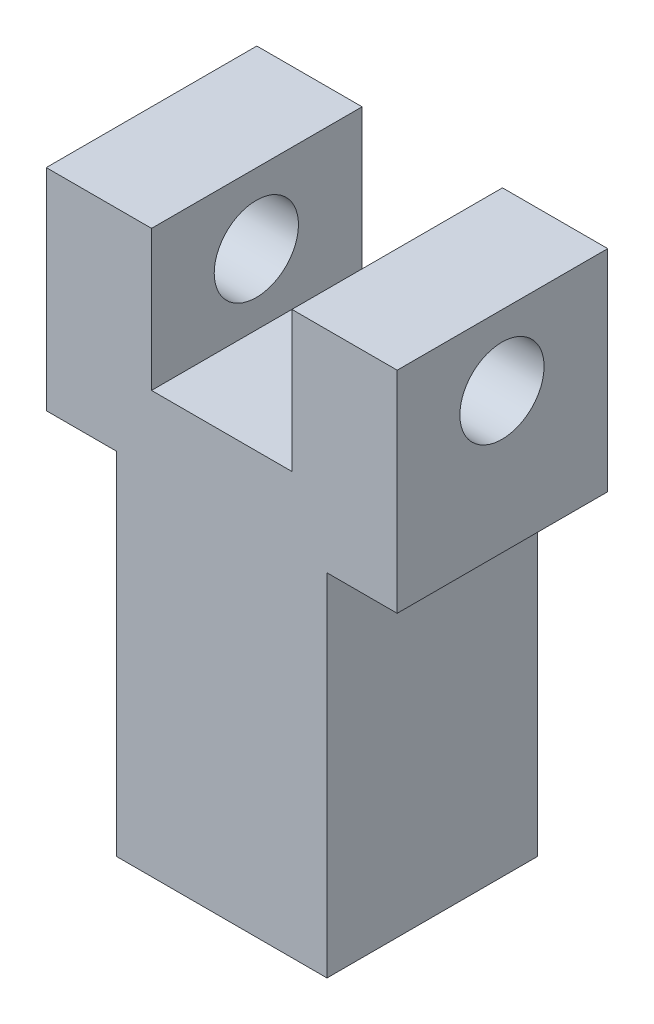
ISO-10303-21;
HEADER;
FILE_DESCRIPTION(('STEP AP214'),'2;1');
FILE_NAME('part.step','',(''),(''),'','','');
FILE_SCHEMA(('AUTOMOTIVE_DESIGN { 1 0 10303 214 1 1 1 1 }'));
ENDSEC;
DATA;
#1=APPLICATION_CONTEXT('core data for automotive mechanical design processes');
#2=APPLICATION_PROTOCOL_DEFINITION('international standard','automotive_design',2000,#1);
#3=PRODUCT_CONTEXT('',#1,'mechanical');
#4=PRODUCT('Part','Part','',(#3));
#5=PRODUCT_RELATED_PRODUCT_CATEGORY('part','',(#4));
#6=PRODUCT_DEFINITION_FORMATION('','',#4);
#7=PRODUCT_DEFINITION_CONTEXT('part definition',#1,'design');
#8=PRODUCT_DEFINITION('design','',#6,#7);
#9=PRODUCT_DEFINITION_SHAPE('','',#8);
#10=(LENGTH_UNIT() NAMED_UNIT(*) SI_UNIT(.MILLI.,.METRE.));
#11=(NAMED_UNIT(*) PLANE_ANGLE_UNIT() SI_UNIT($,.RADIAN.));
#12=(NAMED_UNIT(*) SI_UNIT($,.STERADIAN.) SOLID_ANGLE_UNIT());
#13=UNCERTAINTY_MEASURE_WITH_UNIT(LENGTH_MEASURE(1.E-05),#10,'distance_accuracy_value','');
#14=(GEOMETRIC_REPRESENTATION_CONTEXT(3) GLOBAL_UNCERTAINTY_ASSIGNED_CONTEXT((#13)) GLOBAL_UNIT_ASSIGNED_CONTEXT((#10,
#11,#12)) REPRESENTATION_CONTEXT('',''));
#15=CARTESIAN_POINT('',(0.,0.,0.));
#16=DIRECTION('',(0.,0.,1.));
#17=DIRECTION('',(1.,0.,0.));
#18=AXIS2_PLACEMENT_3D('',#15,#16,#17);
#19=CARTESIAN_POINT('',(-6.31241870357921,-36.0651970931253,9.91556758087119));
#20=DIRECTION('',(1.,0.,0.));
#21=DIRECTION('',(0.,0.,-1.));
#22=AXIS2_PLACEMENT_3D('',#19,#20,#21);
#23=PLANE('',#22);
#24=CARTESIAN_POINT('',(-6.31241870357921,-23.5651970931253,7.5));
#25=DIRECTION('',(1.,0.,0.));
#26=DIRECTION('',(0.,0.,-1.));
#27=AXIS2_PLACEMENT_3D('',#24,#25,#26);
#28=CIRCLE('',#27,3.);
#29=CARTESIAN_POINT('',(-6.31241870357921,-22.0418097257903,4.91556758087119));
#30=VERTEX_POINT('',#29);
#31=CARTESIAN_POINT('',(-6.31241870357921,-21.78614305734,9.91556758087119));
#32=VERTEX_POINT('',#31);
#33=EDGE_CURVE('E184',#30,#32,#28,.T.);
#34=ORIENTED_EDGE('',*,*,#33,.F.);
#35=DIRECTION('',(0.,1.,0.));
#36=VECTOR('',#35,1.);
#37=CARTESIAN_POINT('',(-6.31241870357921,-36.0651970931253,4.91556758087119));
#38=LINE('',#37,#36);
#39=CARTESIAN_POINT('',(-6.31241870357921,-11.0651970931253,4.91556758087119));
#40=VERTEX_POINT('',#39);
#41=EDGE_CURVE('E240',#30,#40,#38,.T.);
#42=ORIENTED_EDGE('',*,*,#41,.T.);
#43=DIRECTION('',(0.,0.,-1.));
#44=VECTOR('',#43,1.);
#45=CARTESIAN_POINT('',(-6.31241870357921,-11.0651970931253,9.91556758087119));
#46=LINE('',#45,#44);
#47=CARTESIAN_POINT('',(-6.31241870357921,-11.0651970931253,9.91556758087119));
#48=VERTEX_POINT('',#47);
#49=EDGE_CURVE('E231',#48,#40,#46,.T.);
#50=ORIENTED_EDGE('',*,*,#49,.F.);
#51=DIRECTION('',(0.,1.,0.));
#52=VECTOR('',#51,1.);
#53=CARTESIAN_POINT('',(-6.31241870357921,-36.0651970931253,9.91556758087119));
#54=LINE('',#53,#52);
#55=EDGE_CURVE('E245',#32,#48,#54,.T.);
#56=ORIENTED_EDGE('',*,*,#55,.F.);
#57=EDGE_LOOP('',(#34,#42,#50,#56));
#58=FACE_BOUND('',#57,.T.);
#59=ADVANCED_FACE('F39',(#58),#23,.T.);
#60=CARTESIAN_POINT('',(-13.8124187035792,-11.0651970931253,15.));
#61=DIRECTION('',(0.,1.,0.));
#62=DIRECTION('',(0.,0.,1.));
#63=AXIS2_PLACEMENT_3D('',#60,#61,#62);
#64=PLANE('',#63);
#65=DIRECTION('',(0.,0.,-1.));
#66=VECTOR('',#65,1.);
#67=CARTESIAN_POINT('',(-8.81241870357921,-11.0651970931253,15.));
#68=LINE('',#67,#66);
#69=CARTESIAN_POINT('',(-8.81241870357921,-11.0651970931253,15.));
#70=VERTEX_POINT('',#69);
#71=CARTESIAN_POINT('',(-8.81241870357921,-11.0651970931253,0.));
#72=VERTEX_POINT('',#71);
#73=EDGE_CURVE('E253',#70,#72,#68,.T.);
#74=ORIENTED_EDGE('',*,*,#73,.F.);
#75=DIRECTION('',(1.,0.,0.));
#76=VECTOR('',#75,1.);
#77=CARTESIAN_POINT('',(-13.8124187035792,-11.0651970931253,15.));
#78=LINE('',#77,#76);
#79=CARTESIAN_POINT('',(-13.8124187035792,-11.0651970931253,15.));
#80=VERTEX_POINT('',#79);
#81=EDGE_CURVE('E310',#80,#70,#78,.T.);
#82=ORIENTED_EDGE('',*,*,#81,.F.);
#83=DIRECTION('',(0.,0.,-1.));
#84=VECTOR('',#83,1.);
#85=CARTESIAN_POINT('',(-13.8124187035792,-11.0651970931253,15.));
#86=LINE('',#85,#84);
#87=CARTESIAN_POINT('',(-13.8124187035792,-11.0651970931253,0.));
#88=VERTEX_POINT('',#87);
#89=EDGE_CURVE('E384',#80,#88,#86,.T.);
#90=ORIENTED_EDGE('',*,*,#89,.T.);
#91=DIRECTION('',(1.,0.,0.));
#92=VECTOR('',#91,1.);
#93=CARTESIAN_POINT('',(-13.8124187035792,-11.0651970931253,0.));
#94=LINE('',#93,#92);
#95=EDGE_CURVE('E337',#88,#72,#94,.T.);
#96=ORIENTED_EDGE('',*,*,#95,.T.);
#97=EDGE_LOOP('',(#74,#82,#90,#96));
#98=FACE_BOUND('',#97,.T.);
#99=ADVANCED_FACE('F410',(#98),#64,.F.);
#100=DIRECTION('',(0.,0.,1.));
#101=VECTOR('',#100,1.);
#102=CARTESIAN_POINT('',(6.18758129642079,-11.0651970931253,15.));
#103=LINE('',#102,#101);
#104=CARTESIAN_POINT('',(6.18758129642079,-11.0651970931253,0.));
#105=VERTEX_POINT('',#104);
#106=CARTESIAN_POINT('',(6.18758129642079,-11.0651970931253,15.));
#107=VERTEX_POINT('',#106);
#108=EDGE_CURVE('E259',#105,#107,#103,.T.);
#109=ORIENTED_EDGE('',*,*,#108,.F.);
#110=CARTESIAN_POINT('',(11.1875812964208,-11.0651970931253,0.));
#111=VERTEX_POINT('',#110);
#112=EDGE_CURVE('E336',#105,#111,#94,.T.);
#113=ORIENTED_EDGE('',*,*,#112,.T.);
#114=DIRECTION('',(0.,0.,-1.));
#115=VECTOR('',#114,1.);
#116=CARTESIAN_POINT('',(11.1875812964208,-11.0651970931253,15.));
#117=LINE('',#116,#115);
#118=CARTESIAN_POINT('',(11.1875812964208,-11.0651970931253,15.));
#119=VERTEX_POINT('',#118);
#120=EDGE_CURVE('E380',#119,#111,#117,.T.);
#121=ORIENTED_EDGE('',*,*,#120,.F.);
#122=EDGE_CURVE('E308',#107,#119,#78,.T.);
#123=ORIENTED_EDGE('',*,*,#122,.F.);
#124=EDGE_LOOP('',(#109,#113,#121,#123));
#125=FACE_BOUND('',#124,.T.);
#126=ADVANCED_FACE('F419',(#125),#64,.F.);
#127=CARTESIAN_POINT('',(-13.8124187035792,3.93480290687469,15.));
#128=DIRECTION('',(1.,0.,0.));
#129=DIRECTION('',(0.,1.,0.));
#130=AXIS2_PLACEMENT_3D('',#127,#128,#129);
#131=PLANE('',#130);
#132=CARTESIAN_POINT('',(-13.8124187035792,-1.06519709312532,7.53488430776738));
#133=DIRECTION('',(1.,0.,0.));
#134=DIRECTION('',(0.,1.,0.));
#135=AXIS2_PLACEMENT_3D('',#132,#133,#134);
#136=CIRCLE('',#135,3.);
#137=CARTESIAN_POINT('',(-13.8124187035792,1.93480290687469,7.53488430776738));
#138=VERTEX_POINT('',#137);
#139=EDGE_CURVE('E299',#138,#138,#136,.T.);
#140=ORIENTED_EDGE('',*,*,#139,.T.);
#141=EDGE_LOOP('',(#140));
#142=FACE_BOUND('',#141,.T.);
#143=DIRECTION('',(0.,-1.,0.));
#144=VECTOR('',#143,1.);
#145=CARTESIAN_POINT('',(-13.8124187035792,3.93480290687469,0.));
#146=LINE('',#145,#144);
#147=CARTESIAN_POINT('',(-13.8124187035792,3.93480290687469,0.));
#148=VERTEX_POINT('',#147);
#149=EDGE_CURVE('E303',#148,#88,#146,.T.);
#150=ORIENTED_EDGE('',*,*,#149,.T.);
#151=ORIENTED_EDGE('',*,*,#89,.F.);
#152=DIRECTION('',(0.,-1.,0.));
#153=VECTOR('',#152,1.);
#154=CARTESIAN_POINT('',(-13.8124187035792,3.93480290687469,15.));
#155=LINE('',#154,#153);
#156=CARTESIAN_POINT('',(-13.8124187035792,3.93480290687469,15.));
#157=VERTEX_POINT('',#156);
#158=EDGE_CURVE('E304',#157,#80,#155,.T.);
#159=ORIENTED_EDGE('',*,*,#158,.F.);
#160=DIRECTION('',(0.,0.,-1.));
#161=VECTOR('',#160,1.);
#162=CARTESIAN_POINT('',(-13.8124187035792,3.93480290687469,15.));
#163=LINE('',#162,#161);
#164=EDGE_CURVE('E332',#157,#148,#163,.T.);
#165=ORIENTED_EDGE('',*,*,#164,.T.);
#166=EDGE_LOOP('',(#150,#151,#159,#165));
#167=FACE_BOUND('',#166,.T.);
#168=ADVANCED_FACE('F41',(#142,#167),#131,.F.);
#169=CARTESIAN_POINT('',(11.1875812964208,3.93480290687469,15.));
#170=DIRECTION('',(-1.,0.,0.));
#171=DIRECTION('',(0.,-1.,0.));
#172=AXIS2_PLACEMENT_3D('',#169,#170,#171);
#173=PLANE('',#172);
#174=CARTESIAN_POINT('',(11.1875812964208,-1.06519709312531,7.53488430776738));
#175=DIRECTION('',(1.,0.,0.));
#176=DIRECTION('',(0.,1.,0.));
#177=AXIS2_PLACEMENT_3D('',#174,#175,#176);
#178=CIRCLE('',#177,3.);
#179=CARTESIAN_POINT('',(11.1875812964208,1.93480290687469,7.53488430776738));
#180=VERTEX_POINT('',#179);
#181=EDGE_CURVE('E290',#180,#180,#178,.T.);
#182=ORIENTED_EDGE('',*,*,#181,.F.);
#183=EDGE_LOOP('',(#182));
#184=FACE_BOUND('',#183,.T.);
#185=DIRECTION('',(0.,1.,0.));
#186=VECTOR('',#185,1.);
#187=CARTESIAN_POINT('',(11.1875812964208,3.93480290687469,0.));
#188=LINE('',#187,#186);
#189=CARTESIAN_POINT('',(11.1875812964208,3.93480290687469,0.));
#190=VERTEX_POINT('',#189);
#191=EDGE_CURVE('E340',#111,#190,#188,.T.);
#192=ORIENTED_EDGE('',*,*,#191,.T.);
#193=DIRECTION('',(0.,0.,-1.));
#194=VECTOR('',#193,1.);
#195=CARTESIAN_POINT('',(11.1875812964208,3.93480290687469,15.));
#196=LINE('',#195,#194);
#197=CARTESIAN_POINT('',(11.1875812964208,3.93480290687469,15.));
#198=VERTEX_POINT('',#197);
#199=EDGE_CURVE('E376',#198,#190,#196,.T.);
#200=ORIENTED_EDGE('',*,*,#199,.F.);
#201=DIRECTION('',(0.,1.,0.));
#202=VECTOR('',#201,1.);
#203=CARTESIAN_POINT('',(11.1875812964208,3.93480290687469,15.));
#204=LINE('',#203,#202);
#205=EDGE_CURVE('E314',#119,#198,#204,.T.);
#206=ORIENTED_EDGE('',*,*,#205,.F.);
#207=ORIENTED_EDGE('',*,*,#120,.T.);
#208=EDGE_LOOP('',(#192,#200,#206,#207));
#209=FACE_BOUND('',#208,.T.);
#210=ADVANCED_FACE('F457',(#184,#209),#173,.F.);
#211=CARTESIAN_POINT('',(3.68758129642079,3.93480290687469,15.));
#212=DIRECTION('',(0.,-1.,0.));
#213=DIRECTION('',(0.,0.,-1.));
#214=AXIS2_PLACEMENT_3D('',#211,#212,#213);
#215=PLANE('',#214);
#216=DIRECTION('',(-1.,0.,0.));
#217=VECTOR('',#216,1.);
#218=CARTESIAN_POINT('',(3.68758129642079,3.93480290687469,0.));
#219=LINE('',#218,#217);
#220=CARTESIAN_POINT('',(3.68758129642079,3.93480290687469,0.));
#221=VERTEX_POINT('',#220);
#222=EDGE_CURVE('E343',#190,#221,#219,.T.);
#223=ORIENTED_EDGE('',*,*,#222,.T.);
#224=DIRECTION('',(0.,0.,-1.));
#225=VECTOR('',#224,1.);
#226=CARTESIAN_POINT('',(3.68758129642079,3.93480290687469,15.));
#227=LINE('',#226,#225);
#228=CARTESIAN_POINT('',(3.68758129642079,3.93480290687469,15.));
#229=VERTEX_POINT('',#228);
#230=EDGE_CURVE('E372',#229,#221,#227,.T.);
#231=ORIENTED_EDGE('',*,*,#230,.F.);
#232=DIRECTION('',(-1.,0.,0.));
#233=VECTOR('',#232,1.);
#234=CARTESIAN_POINT('',(3.68758129642079,3.93480290687469,15.));
#235=LINE('',#234,#233);
#236=EDGE_CURVE('E317',#198,#229,#235,.T.);
#237=ORIENTED_EDGE('',*,*,#236,.F.);
#238=ORIENTED_EDGE('',*,*,#199,.T.);
#239=EDGE_LOOP('',(#223,#231,#237,#238));
#240=FACE_BOUND('',#239,.T.);
#241=ADVANCED_FACE('F462',(#240),#215,.F.);
#242=CARTESIAN_POINT('',(3.68758129642079,3.93480290687469,15.));
#243=DIRECTION('',(1.,0.,0.));
#244=DIRECTION('',(0.,1.,0.));
#245=AXIS2_PLACEMENT_3D('',#242,#243,#244);
#246=PLANE('',#245);
#247=CARTESIAN_POINT('',(3.68758129642079,-1.06519709312531,7.53488430776738));
#248=DIRECTION('',(1.,0.,0.));
#249=DIRECTION('',(0.,1.,0.));
#250=AXIS2_PLACEMENT_3D('',#247,#248,#249);
#251=CIRCLE('',#250,3.);
#252=CARTESIAN_POINT('',(3.68758129642079,1.93480290687469,7.53488430776738));
#253=VERTEX_POINT('',#252);
#254=EDGE_CURVE('E295',#253,#253,#251,.T.);
#255=ORIENTED_EDGE('',*,*,#254,.T.);
#256=EDGE_LOOP('',(#255));
#257=FACE_BOUND('',#256,.T.);
#258=DIRECTION('',(0.,-1.,0.));
#259=VECTOR('',#258,1.);
#260=CARTESIAN_POINT('',(3.68758129642079,3.93480290687469,0.));
#261=LINE('',#260,#259);
#262=CARTESIAN_POINT('',(3.68758129642079,-6.06519709312531,0.));
#263=VERTEX_POINT('',#262);
#264=EDGE_CURVE('E346',#221,#263,#261,.T.);
#265=ORIENTED_EDGE('',*,*,#264,.T.);
#266=DIRECTION('',(0.,0.,-1.));
#267=VECTOR('',#266,1.);
#268=CARTESIAN_POINT('',(3.68758129642079,-6.06519709312531,15.));
#269=LINE('',#268,#267);
#270=CARTESIAN_POINT('',(3.68758129642079,-6.06519709312531,15.));
#271=VERTEX_POINT('',#270);
#272=EDGE_CURVE('E368',#271,#263,#269,.T.);
#273=ORIENTED_EDGE('',*,*,#272,.F.);
#274=DIRECTION('',(0.,-1.,0.));
#275=VECTOR('',#274,1.);
#276=CARTESIAN_POINT('',(3.68758129642079,3.93480290687469,15.));
#277=LINE('',#276,#275);
#278=EDGE_CURVE('E320',#229,#271,#277,.T.);
#279=ORIENTED_EDGE('',*,*,#278,.F.);
#280=ORIENTED_EDGE('',*,*,#230,.T.);
#281=EDGE_LOOP('',(#265,#273,#279,#280));
#282=FACE_BOUND('',#281,.T.);
#283=ADVANCED_FACE('F468',(#257,#282),#246,.F.);
#284=CARTESIAN_POINT('',(3.68758129642079,-6.06519709312531,15.));
#285=DIRECTION('',(0.,-1.,0.));
#286=DIRECTION('',(0.,0.,-1.));
#287=AXIS2_PLACEMENT_3D('',#284,#285,#286);
#288=PLANE('',#287);
#289=DIRECTION('',(-1.,0.,0.));
#290=VECTOR('',#289,1.);
#291=CARTESIAN_POINT('',(3.68758129642079,-6.06519709312531,0.));
#292=LINE('',#291,#290);
#293=CARTESIAN_POINT('',(-6.31241870357921,-6.06519709312531,0.));
#294=VERTEX_POINT('',#293);
#295=EDGE_CURVE('E349',#263,#294,#292,.T.);
#296=ORIENTED_EDGE('',*,*,#295,.T.);
#297=DIRECTION('',(0.,0.,-1.));
#298=VECTOR('',#297,1.);
#299=CARTESIAN_POINT('',(-6.31241870357921,-6.06519709312531,15.));
#300=LINE('',#299,#298);
#301=CARTESIAN_POINT('',(-6.31241870357921,-6.06519709312531,15.));
#302=VERTEX_POINT('',#301);
#303=EDGE_CURVE('E364',#302,#294,#300,.T.);
#304=ORIENTED_EDGE('',*,*,#303,.F.);
#305=DIRECTION('',(-1.,0.,0.));
#306=VECTOR('',#305,1.);
#307=CARTESIAN_POINT('',(3.68758129642079,-6.06519709312531,15.));
#308=LINE('',#307,#306);
#309=EDGE_CURVE('E323',#271,#302,#308,.T.);
#310=ORIENTED_EDGE('',*,*,#309,.F.);
#311=ORIENTED_EDGE('',*,*,#272,.T.);
#312=EDGE_LOOP('',(#296,#304,#310,#311));
#313=FACE_BOUND('',#312,.T.);
#314=ADVANCED_FACE('F472',(#313),#288,.F.);
#315=CARTESIAN_POINT('',(-6.31241870357921,-6.06519709312531,15.));
#316=DIRECTION('',(-1.,0.,0.));
#317=DIRECTION('',(0.,0.,1.));
#318=AXIS2_PLACEMENT_3D('',#315,#316,#317);
#319=PLANE('',#318);
#320=CARTESIAN_POINT('',(-6.31241870357921,-1.06519709312531,7.53488430776738));
#321=DIRECTION('',(-1.,0.,0.));
#322=DIRECTION('',(0.,0.,1.));
#323=AXIS2_PLACEMENT_3D('',#320,#321,#322);
#324=CIRCLE('',#323,3.);
#325=CARTESIAN_POINT('',(-6.31241870357921,-1.06519709312531,10.5348843077674));
#326=VERTEX_POINT('',#325);
#327=EDGE_CURVE('E294',#326,#326,#324,.T.);
#328=ORIENTED_EDGE('',*,*,#327,.T.);
#329=EDGE_LOOP('',(#328));
#330=FACE_BOUND('',#329,.T.);
#331=DIRECTION('',(0.,1.,0.));
#332=VECTOR('',#331,1.);
#333=CARTESIAN_POINT('',(-6.31241870357921,-6.06519709312531,0.));
#334=LINE('',#333,#332);
#335=CARTESIAN_POINT('',(-6.31241870357921,3.93480290687469,0.));
#336=VERTEX_POINT('',#335);
#337=EDGE_CURVE('E352',#294,#336,#334,.T.);
#338=ORIENTED_EDGE('',*,*,#337,.T.);
#339=DIRECTION('',(0.,0.,-1.));
#340=VECTOR('',#339,1.);
#341=CARTESIAN_POINT('',(-6.31241870357921,3.93480290687469,15.));
#342=LINE('',#341,#340);
#343=CARTESIAN_POINT('',(-6.31241870357921,3.93480290687469,15.));
#344=VERTEX_POINT('',#343);
#345=EDGE_CURVE('E360',#344,#336,#342,.T.);
#346=ORIENTED_EDGE('',*,*,#345,.F.);
#347=DIRECTION('',(0.,1.,0.));
#348=VECTOR('',#347,1.);
#349=CARTESIAN_POINT('',(-6.31241870357921,-6.06519709312531,15.));
#350=LINE('',#349,#348);
#351=EDGE_CURVE('E326',#302,#344,#350,.T.);
#352=ORIENTED_EDGE('',*,*,#351,.F.);
#353=ORIENTED_EDGE('',*,*,#303,.T.);
#354=EDGE_LOOP('',(#338,#346,#352,#353));
#355=FACE_BOUND('',#354,.T.);
#356=ADVANCED_FACE('F477',(#330,#355),#319,.F.);
#357=CARTESIAN_POINT('',(-13.8124187035792,3.93480290687469,15.));
#358=DIRECTION('',(0.,-1.,0.));
#359=DIRECTION('',(1.,0.,0.));
#360=AXIS2_PLACEMENT_3D('',#357,#358,#359);
#361=PLANE('',#360);
#362=DIRECTION('',(-1.,0.,0.));
#363=VECTOR('',#362,1.);
#364=CARTESIAN_POINT('',(-13.8124187035792,3.93480290687469,0.));
#365=LINE('',#364,#363);
#366=EDGE_CURVE('E309',#336,#148,#365,.T.);
#367=ORIENTED_EDGE('',*,*,#366,.T.);
#368=ORIENTED_EDGE('',*,*,#164,.F.);
#369=DIRECTION('',(-1.,0.,0.));
#370=VECTOR('',#369,1.);
#371=CARTESIAN_POINT('',(-13.8124187035792,3.93480290687469,15.));
#372=LINE('',#371,#370);
#373=EDGE_CURVE('E329',#344,#157,#372,.T.);
#374=ORIENTED_EDGE('',*,*,#373,.F.);
#375=ORIENTED_EDGE('',*,*,#345,.T.);
#376=EDGE_LOOP('',(#367,#368,#374,#375));
#377=FACE_BOUND('',#376,.T.);
#378=ADVANCED_FACE('F483',(#377),#361,.F.);
#379=CARTESIAN_POINT('',(0.,0.,15.));
#380=DIRECTION('',(0.,0.,1.));
#381=DIRECTION('',(1.,0.,0.));
#382=AXIS2_PLACEMENT_3D('',#379,#380,#381);
#383=PLANE('',#382);
#384=ORIENTED_EDGE('',*,*,#158,.T.);
#385=ORIENTED_EDGE('',*,*,#81,.T.);
#386=DIRECTION('',(0.,1.,0.));
#387=VECTOR('',#386,1.);
#388=CARTESIAN_POINT('',(-8.81241870357921,-36.0651970931253,15.));
#389=LINE('',#388,#387);
#390=CARTESIAN_POINT('',(-8.81241870357921,-36.0651970931253,15.));
#391=VERTEX_POINT('',#390);
#392=EDGE_CURVE('E268',#391,#70,#389,.T.);
#393=ORIENTED_EDGE('',*,*,#392,.F.);
#394=DIRECTION('',(-1.,0.,0.));
#395=VECTOR('',#394,1.);
#396=CARTESIAN_POINT('',(-8.81241870357921,-36.0651970931253,15.));
#397=LINE('',#396,#395);
#398=CARTESIAN_POINT('',(6.18758129642079,-36.0651970931253,15.));
#399=VERTEX_POINT('',#398);
#400=EDGE_CURVE('E265',#399,#391,#397,.T.);
#401=ORIENTED_EDGE('',*,*,#400,.F.);
#402=DIRECTION('',(0.,1.,0.));
#403=VECTOR('',#402,1.);
#404=CARTESIAN_POINT('',(6.18758129642079,-36.0651970931253,15.));
#405=LINE('',#404,#403);
#406=EDGE_CURVE('E278',#399,#107,#405,.T.);
#407=ORIENTED_EDGE('',*,*,#406,.T.);
#408=ORIENTED_EDGE('',*,*,#122,.T.);
#409=ORIENTED_EDGE('',*,*,#205,.T.);
#410=ORIENTED_EDGE('',*,*,#236,.T.);
#411=ORIENTED_EDGE('',*,*,#278,.T.);
#412=ORIENTED_EDGE('',*,*,#309,.T.);
#413=ORIENTED_EDGE('',*,*,#351,.T.);
#414=ORIENTED_EDGE('',*,*,#373,.T.);
#415=EDGE_LOOP('',(#384,#385,#393,#401,#407,#408,#409,#410,#411,#412,#413,#414));
#416=FACE_BOUND('',#415,.T.);
#417=ADVANCED_FACE('F448',(#416),#383,.T.);
#418=CARTESIAN_POINT('',(0.,0.,0.));
#419=DIRECTION('',(0.,0.,1.));
#420=DIRECTION('',(1.,0.,0.));
#421=AXIS2_PLACEMENT_3D('',#418,#419,#420);
#422=PLANE('',#421);
#423=ORIENTED_EDGE('',*,*,#149,.F.);
#424=ORIENTED_EDGE('',*,*,#366,.F.);
#425=ORIENTED_EDGE('',*,*,#337,.F.);
#426=ORIENTED_EDGE('',*,*,#295,.F.);
#427=ORIENTED_EDGE('',*,*,#264,.F.);
#428=ORIENTED_EDGE('',*,*,#222,.F.);
#429=ORIENTED_EDGE('',*,*,#191,.F.);
#430=ORIENTED_EDGE('',*,*,#112,.F.);
#431=DIRECTION('',(0.,1.,0.));
#432=VECTOR('',#431,1.);
#433=CARTESIAN_POINT('',(6.18758129642079,-36.0651970931253,0.));
#434=LINE('',#433,#432);
#435=CARTESIAN_POINT('',(6.18758129642079,-36.0651970931253,0.));
#436=VERTEX_POINT('',#435);
#437=EDGE_CURVE('E282',#436,#105,#434,.T.);
#438=ORIENTED_EDGE('',*,*,#437,.F.);
#439=DIRECTION('',(1.,0.,0.));
#440=VECTOR('',#439,1.);
#441=CARTESIAN_POINT('',(-8.81241870357921,-36.0651970931253,0.));
#442=LINE('',#441,#440);
#443=CARTESIAN_POINT('',(-8.81241870357921,-36.0651970931253,0.));
#444=VERTEX_POINT('',#443);
#445=EDGE_CURVE('E258',#444,#436,#442,.T.);
#446=ORIENTED_EDGE('',*,*,#445,.F.);
#447=DIRECTION('',(0.,1.,0.));
#448=VECTOR('',#447,1.);
#449=CARTESIAN_POINT('',(-8.81241870357921,-36.0651970931253,0.));
#450=LINE('',#449,#448);
#451=EDGE_CURVE('E286',#444,#72,#450,.T.);
#452=ORIENTED_EDGE('',*,*,#451,.T.);
#453=ORIENTED_EDGE('',*,*,#95,.F.);
#454=EDGE_LOOP('',(#423,#424,#425,#426,#427,#428,#429,#430,#438,#446,#452,#453));
#455=FACE_BOUND('',#454,.T.);
#456=ADVANCED_FACE('F498',(#455),#422,.F.);
#457=CARTESIAN_POINT('',(-23.8124187035792,-1.06519709312532,7.53488430776738));
#458=DIRECTION('',(1.,0.,0.));
#459=DIRECTION('',(0.,1.,0.));
#460=AXIS2_PLACEMENT_3D('',#457,#458,#459);
#461=CYLINDRICAL_SURFACE('',#460,3.);
#462=ORIENTED_EDGE('',*,*,#327,.F.);
#463=EDGE_LOOP('',(#462));
#464=FACE_BOUND('',#463,.T.);
#465=ORIENTED_EDGE('',*,*,#139,.F.);
#466=EDGE_LOOP('',(#465));
#467=FACE_BOUND('',#466,.T.);
#468=ADVANCED_FACE('F500',(#464,#467),#461,.F.);
#469=ORIENTED_EDGE('',*,*,#181,.T.);
#470=EDGE_LOOP('',(#469));
#471=FACE_BOUND('',#470,.T.);
#472=ORIENTED_EDGE('',*,*,#254,.F.);
#473=EDGE_LOOP('',(#472));
#474=FACE_BOUND('',#473,.T.);
#475=ADVANCED_FACE('F505',(#471,#474),#461,.F.);
#476=CARTESIAN_POINT('',(0.,-36.0651970931253,0.));
#477=DIRECTION('',(0.,-1.,0.));
#478=DIRECTION('',(0.,0.,-1.));
#479=AXIS2_PLACEMENT_3D('',#476,#477,#478);
#480=PLANE('',#479);
#481=DIRECTION('',(0.,0.,-1.));
#482=VECTOR('',#481,1.);
#483=CARTESIAN_POINT('',(-8.81241870357921,-36.0651970931253,15.));
#484=LINE('',#483,#482);
#485=EDGE_CURVE('E254',#391,#444,#484,.T.);
#486=ORIENTED_EDGE('',*,*,#485,.T.);
#487=ORIENTED_EDGE('',*,*,#445,.T.);
#488=DIRECTION('',(0.,0.,1.));
#489=VECTOR('',#488,1.);
#490=CARTESIAN_POINT('',(6.18758129642079,-36.0651970931253,15.));
#491=LINE('',#490,#489);
#492=EDGE_CURVE('E262',#436,#399,#491,.T.);
#493=ORIENTED_EDGE('',*,*,#492,.T.);
#494=ORIENTED_EDGE('',*,*,#400,.T.);
#495=EDGE_LOOP('',(#486,#487,#493,#494));
#496=FACE_BOUND('',#495,.T.);
#497=DIRECTION('',(-1.,0.,0.));
#498=VECTOR('',#497,1.);
#499=CARTESIAN_POINT('',(3.68758129642079,-36.0651970931253,9.9155675808712));
#500=LINE('',#499,#498);
#501=CARTESIAN_POINT('',(3.68758129642079,-36.0651970931253,9.9155675808712));
#502=VERTEX_POINT('',#501);
#503=CARTESIAN_POINT('',(-6.31241870357921,-36.0651970931253,9.91556758087119));
#504=VERTEX_POINT('',#503);
#505=EDGE_CURVE('E213',#502,#504,#500,.T.);
#506=ORIENTED_EDGE('',*,*,#505,.F.);
#507=DIRECTION('',(0.,0.,1.));
#508=VECTOR('',#507,1.);
#509=CARTESIAN_POINT('',(3.68758129642079,-36.0651970931253,9.9155675808712));
#510=LINE('',#509,#508);
#511=CARTESIAN_POINT('',(3.68758129642079,-36.0651970931253,4.91556758087119));
#512=VERTEX_POINT('',#511);
#513=EDGE_CURVE('E210',#512,#502,#510,.T.);
#514=ORIENTED_EDGE('',*,*,#513,.F.);
#515=DIRECTION('',(1.,0.,0.));
#516=VECTOR('',#515,1.);
#517=CARTESIAN_POINT('',(3.68758129642079,-36.0651970931253,4.91556758087119));
#518=LINE('',#517,#516);
#519=CARTESIAN_POINT('',(-6.31241870357921,-36.0651970931253,4.91556758087119));
#520=VERTEX_POINT('',#519);
#521=EDGE_CURVE('E221',#520,#512,#518,.T.);
#522=ORIENTED_EDGE('',*,*,#521,.F.);
#523=DIRECTION('',(0.,0.,-1.));
#524=VECTOR('',#523,1.);
#525=CARTESIAN_POINT('',(-6.31241870357921,-36.0651970931253,9.91556758087119));
#526=LINE('',#525,#524);
#527=EDGE_CURVE('E217',#504,#520,#526,.T.);
#528=ORIENTED_EDGE('',*,*,#527,.F.);
#529=EDGE_LOOP('',(#506,#514,#522,#528));
#530=FACE_BOUND('',#529,.T.);
#531=ADVANCED_FACE('F436',(#496,#530),#480,.T.);
#532=CARTESIAN_POINT('',(-8.81241870357921,-36.0651970931253,15.));
#533=DIRECTION('',(1.,0.,0.));
#534=DIRECTION('',(0.,0.,-1.));
#535=AXIS2_PLACEMENT_3D('',#532,#533,#534);
#536=PLANE('',#535);
#537=CARTESIAN_POINT('',(-8.81241870357921,-23.5651970931253,7.5));
#538=DIRECTION('',(-1.,0.,0.));
#539=DIRECTION('',(0.,0.,1.));
#540=AXIS2_PLACEMENT_3D('',#537,#538,#539);
#541=CIRCLE('',#540,3.);
#542=CARTESIAN_POINT('',(-8.81241870357921,-23.5651970931253,10.5));
#543=VERTEX_POINT('',#542);
#544=EDGE_CURVE('E195',#543,#543,#541,.T.);
#545=ORIENTED_EDGE('',*,*,#544,.F.);
#546=EDGE_LOOP('',(#545));
#547=FACE_BOUND('',#546,.T.);
#548=ORIENTED_EDGE('',*,*,#73,.T.);
#549=ORIENTED_EDGE('',*,*,#451,.F.);
#550=ORIENTED_EDGE('',*,*,#485,.F.);
#551=ORIENTED_EDGE('',*,*,#392,.T.);
#552=EDGE_LOOP('',(#548,#549,#550,#551));
#553=FACE_BOUND('',#552,.T.);
#554=ADVANCED_FACE('F490',(#547,#553),#536,.F.);
#555=CARTESIAN_POINT('',(6.18758129642079,-36.0651970931253,15.));
#556=DIRECTION('',(-1.,0.,0.));
#557=DIRECTION('',(0.,0.,1.));
#558=AXIS2_PLACEMENT_3D('',#555,#556,#557);
#559=PLANE('',#558);
#560=ORIENTED_EDGE('',*,*,#108,.T.);
#561=ORIENTED_EDGE('',*,*,#406,.F.);
#562=ORIENTED_EDGE('',*,*,#492,.F.);
#563=ORIENTED_EDGE('',*,*,#437,.T.);
#564=EDGE_LOOP('',(#560,#561,#562,#563));
#565=FACE_BOUND('',#564,.T.);
#566=ADVANCED_FACE('F496',(#565),#559,.F.);
#567=CARTESIAN_POINT('',(3.68758129642079,-36.0651970931253,9.9155675808712));
#568=DIRECTION('',(-1.,0.,0.));
#569=DIRECTION('',(0.,0.,1.));
#570=AXIS2_PLACEMENT_3D('',#567,#568,#569);
#571=PLANE('',#570);
#572=DIRECTION('',(0.,0.,1.));
#573=VECTOR('',#572,1.);
#574=CARTESIAN_POINT('',(3.68758129642079,-11.0651970931253,9.9155675808712));
#575=LINE('',#574,#573);
#576=CARTESIAN_POINT('',(3.68758129642079,-11.0651970931253,4.91556758087119));
#577=VERTEX_POINT('',#576);
#578=CARTESIAN_POINT('',(3.68758129642079,-11.0651970931253,9.9155675808712));
#579=VERTEX_POINT('',#578);
#580=EDGE_CURVE('E189',#577,#579,#575,.T.);
#581=ORIENTED_EDGE('',*,*,#580,.F.);
#582=DIRECTION('',(0.,1.,0.));
#583=VECTOR('',#582,1.);
#584=CARTESIAN_POINT('',(3.68758129642079,-36.0651970931253,4.91556758087119));
#585=LINE('',#584,#583);
#586=EDGE_CURVE('E62',#512,#577,#585,.T.);
#587=ORIENTED_EDGE('',*,*,#586,.F.);
#588=ORIENTED_EDGE('',*,*,#513,.T.);
#589=DIRECTION('',(0.,1.,0.));
#590=VECTOR('',#589,1.);
#591=CARTESIAN_POINT('',(3.68758129642079,-36.0651970931253,9.9155675808712));
#592=LINE('',#591,#590);
#593=EDGE_CURVE('E249',#502,#579,#592,.T.);
#594=ORIENTED_EDGE('',*,*,#593,.T.);
#595=EDGE_LOOP('',(#581,#587,#588,#594));
#596=FACE_BOUND('',#595,.T.);
#597=ADVANCED_FACE('F429',(#596),#571,.T.);
#598=CARTESIAN_POINT('',(3.68758129642079,-36.0651970931253,9.9155675808712));
#599=DIRECTION('',(0.,0.,-1.));
#600=DIRECTION('',(-1.,0.,0.));
#601=AXIS2_PLACEMENT_3D('',#598,#599,#600);
#602=PLANE('',#601);
#603=DIRECTION('',(-1.,0.,0.));
#604=VECTOR('',#603,1.);
#605=CARTESIAN_POINT('',(-1.81241870357921,-25.3442511289106,9.91556758087119));
#606=LINE('',#605,#604);
#607=CARTESIAN_POINT('',(-1.81241870357921,-25.3442511289106,9.91556758087119));
#608=VERTEX_POINT('',#607);
#609=CARTESIAN_POINT('',(-6.31241870357921,-25.3442511289106,9.91556758087119));
#610=VERTEX_POINT('',#609);
#611=EDGE_CURVE('E199',#608,#610,#606,.T.);
#612=ORIENTED_EDGE('',*,*,#611,.F.);
#613=DIRECTION('',(0.,1.,0.));
#614=VECTOR('',#613,1.);
#615=CARTESIAN_POINT('',(-1.81241870357921,-36.0651970931253,9.91556758087119));
#616=LINE('',#615,#614);
#617=CARTESIAN_POINT('',(-1.81241870357921,-21.78614305734,9.91556758087119));
#618=VERTEX_POINT('',#617);
#619=EDGE_CURVE('E193',#608,#618,#616,.T.);
#620=ORIENTED_EDGE('',*,*,#619,.T.);
#621=DIRECTION('',(-1.,0.,0.));
#622=VECTOR('',#621,1.);
#623=CARTESIAN_POINT('',(-1.81241870357921,-21.78614305734,9.91556758087119));
#624=LINE('',#623,#622);
#625=EDGE_CURVE('E177',#32,#618,#624,.F.);
#626=ORIENTED_EDGE('',*,*,#625,.F.);
#627=ORIENTED_EDGE('',*,*,#55,.T.);
#628=DIRECTION('',(-1.,0.,0.));
#629=VECTOR('',#628,1.);
#630=CARTESIAN_POINT('',(3.68758129642079,-11.0651970931253,9.9155675808712));
#631=LINE('',#630,#629);
#632=EDGE_CURVE('E227',#579,#48,#631,.T.);
#633=ORIENTED_EDGE('',*,*,#632,.F.);
#634=ORIENTED_EDGE('',*,*,#593,.F.);
#635=ORIENTED_EDGE('',*,*,#505,.T.);
#636=EDGE_CURVE('E246',#504,#610,#54,.T.);
#637=ORIENTED_EDGE('',*,*,#636,.T.);
#638=EDGE_LOOP('',(#612,#620,#626,#627,#633,#634,#635,#637));
#639=FACE_BOUND('',#638,.T.);
#640=ADVANCED_FACE('F197',(#639),#602,.T.);
#641=CARTESIAN_POINT('',(-6.31241870357921,-25.0885844604604,4.91556758087119));
#642=VERTEX_POINT('',#641);
#643=EDGE_CURVE('E201',#610,#642,#28,.T.);
#644=ORIENTED_EDGE('',*,*,#643,.F.);
#645=ORIENTED_EDGE('',*,*,#636,.F.);
#646=ORIENTED_EDGE('',*,*,#527,.T.);
#647=EDGE_CURVE('E241',#520,#642,#38,.T.);
#648=ORIENTED_EDGE('',*,*,#647,.T.);
#649=EDGE_LOOP('',(#644,#645,#646,#648));
#650=FACE_BOUND('',#649,.T.);
#651=ADVANCED_FACE('F413',(#650),#23,.T.);
#652=CARTESIAN_POINT('',(3.68758129642079,-36.0651970931253,4.91556758087119));
#653=DIRECTION('',(0.,0.,1.));
#654=DIRECTION('',(1.,0.,0.));
#655=AXIS2_PLACEMENT_3D('',#652,#653,#654);
#656=PLANE('',#655);
#657=DIRECTION('',(-1.,0.,0.));
#658=VECTOR('',#657,1.);
#659=CARTESIAN_POINT('',(-1.81241870357921,-22.0418097257903,4.91556758087119));
#660=LINE('',#659,#658);
#661=CARTESIAN_POINT('',(-1.81241870357921,-22.0418097257903,4.91556758087119));
#662=VERTEX_POINT('',#661);
#663=EDGE_CURVE('E11',#662,#30,#660,.T.);
#664=ORIENTED_EDGE('',*,*,#663,.F.);
#665=DIRECTION('',(0.,-1.,0.));
#666=VECTOR('',#665,1.);
#667=CARTESIAN_POINT('',(-1.81241870357921,-36.0651970931253,4.91556758087119));
#668=LINE('',#667,#666);
#669=CARTESIAN_POINT('',(-1.81241870357921,-25.0885844604604,4.91556758087119));
#670=VERTEX_POINT('',#669);
#671=EDGE_CURVE('E388',#662,#670,#668,.T.);
#672=ORIENTED_EDGE('',*,*,#671,.T.);
#673=DIRECTION('',(-1.,0.,0.));
#674=VECTOR('',#673,1.);
#675=CARTESIAN_POINT('',(-1.81241870357921,-25.0885844604604,4.91556758087119));
#676=LINE('',#675,#674);
#677=EDGE_CURVE('E48',#642,#670,#676,.F.);
#678=ORIENTED_EDGE('',*,*,#677,.F.);
#679=ORIENTED_EDGE('',*,*,#647,.F.);
#680=ORIENTED_EDGE('',*,*,#521,.T.);
#681=ORIENTED_EDGE('',*,*,#586,.T.);
#682=DIRECTION('',(1.,0.,0.));
#683=VECTOR('',#682,1.);
#684=CARTESIAN_POINT('',(3.68758129642079,-11.0651970931253,4.91556758087119));
#685=LINE('',#684,#683);
#686=EDGE_CURVE('E214',#40,#577,#685,.T.);
#687=ORIENTED_EDGE('',*,*,#686,.F.);
#688=ORIENTED_EDGE('',*,*,#41,.F.);
#689=EDGE_LOOP('',(#664,#672,#678,#679,#680,#681,#687,#688));
#690=FACE_BOUND('',#689,.T.);
#691=ADVANCED_FACE('F398',(#690),#656,.T.);
#692=ORIENTED_EDGE('',*,*,#686,.T.);
#693=ORIENTED_EDGE('',*,*,#580,.T.);
#694=ORIENTED_EDGE('',*,*,#632,.T.);
#695=ORIENTED_EDGE('',*,*,#49,.T.);
#696=EDGE_LOOP('',(#692,#693,#694,#695));
#697=FACE_BOUND('',#696,.T.);
#698=ADVANCED_FACE('F408',(#697),#64,.F.);
#699=CARTESIAN_POINT('',(-1.81241870357921,-23.5651970931253,7.5));
#700=DIRECTION('',(-1.,0.,0.));
#701=DIRECTION('',(0.,0.,1.));
#702=AXIS2_PLACEMENT_3D('',#699,#700,#701);
#703=PLANE('',#702);
#704=CARTESIAN_POINT('',(-1.81241870357921,-23.5651970931253,7.5));
#705=DIRECTION('',(-1.,0.,0.));
#706=DIRECTION('',(0.,0.,1.));
#707=AXIS2_PLACEMENT_3D('',#704,#705,#706);
#708=CIRCLE('',#707,3.);
#709=EDGE_CURVE('E181',#608,#618,#708,.T.);
#710=ORIENTED_EDGE('',*,*,#709,.T.);
#711=ORIENTED_EDGE('',*,*,#619,.F.);
#712=EDGE_LOOP('',(#710,#711));
#713=FACE_BOUND('',#712,.T.);
#714=ADVANCED_FACE('F192',(#713),#703,.T.);
#715=CARTESIAN_POINT('',(-1.81241870357921,-23.5651970931253,7.5));
#716=DIRECTION('',(-1.,0.,0.));
#717=DIRECTION('',(0.,0.,1.));
#718=AXIS2_PLACEMENT_3D('',#715,#716,#717);
#719=CYLINDRICAL_SURFACE('',#718,3.);
#720=ORIENTED_EDGE('',*,*,#625,.T.);
#721=ORIENTED_EDGE('',*,*,#709,.F.);
#722=ORIENTED_EDGE('',*,*,#611,.T.);
#723=ORIENTED_EDGE('',*,*,#643,.T.);
#724=ORIENTED_EDGE('',*,*,#677,.T.);
#725=EDGE_CURVE('E54',#662,#670,#708,.T.);
#726=ORIENTED_EDGE('',*,*,#725,.F.);
#727=ORIENTED_EDGE('',*,*,#663,.T.);
#728=ORIENTED_EDGE('',*,*,#33,.T.);
#729=EDGE_LOOP('',(#720,#721,#722,#723,#724,#726,#727,#728));
#730=FACE_BOUND('',#729,.T.);
#731=ORIENTED_EDGE('',*,*,#544,.T.);
#732=EDGE_LOOP('',(#731));
#733=FACE_BOUND('',#732,.T.);
#734=ADVANCED_FACE('F179',(#730,#733),#719,.F.);
#735=ORIENTED_EDGE('',*,*,#725,.T.);
#736=ORIENTED_EDGE('',*,*,#671,.F.);
#737=EDGE_LOOP('',(#735,#736));
#738=FACE_BOUND('',#737,.T.);
#739=ADVANCED_FACE('F400',(#738),#703,.T.);
#740=CLOSED_SHELL('',(#59,#99,#126,#168,#210,#241,#283,#314,#356,#378,#417,#456,#468,#475,#531,
#554,#566,#597,#640,#651,#691,#698,#714,#734,#739));
#741=MANIFOLD_SOLID_BREP('B2',#740);
#742=ADVANCED_BREP_SHAPE_REPRESENTATION('',(#18,#741),#14);
#743=SHAPE_DEFINITION_REPRESENTATION(#9,#742);
ENDSEC;
END-ISO-10303-21;
